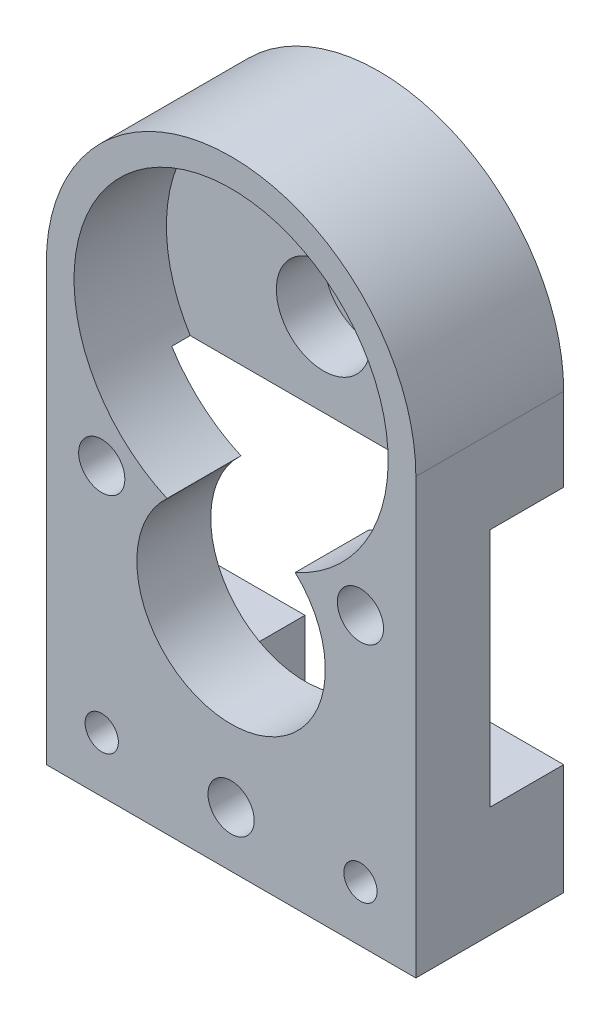
ISO-10303-21;
HEADER;
FILE_DESCRIPTION(('STEP AP214'),'2;1');
FILE_NAME('part.step','',(''),(''),'','','');
FILE_SCHEMA(('AUTOMOTIVE_DESIGN { 1 0 10303 214 1 1 1 1 }'));
ENDSEC;
DATA;
#1=APPLICATION_CONTEXT('core data for automotive mechanical design processes');
#2=APPLICATION_PROTOCOL_DEFINITION('international standard','automotive_design',2000,#1);
#3=PRODUCT_CONTEXT('',#1,'mechanical');
#4=PRODUCT('Part','Part','',(#3));
#5=PRODUCT_RELATED_PRODUCT_CATEGORY('part','',(#4));
#6=PRODUCT_DEFINITION_FORMATION('','',#4);
#7=PRODUCT_DEFINITION_CONTEXT('part definition',#1,'design');
#8=PRODUCT_DEFINITION('design','',#6,#7);
#9=PRODUCT_DEFINITION_SHAPE('','',#8);
#10=(LENGTH_UNIT() NAMED_UNIT(*) SI_UNIT(.MILLI.,.METRE.));
#11=(NAMED_UNIT(*) PLANE_ANGLE_UNIT() SI_UNIT($,.RADIAN.));
#12=(NAMED_UNIT(*) SI_UNIT($,.STERADIAN.) SOLID_ANGLE_UNIT());
#13=UNCERTAINTY_MEASURE_WITH_UNIT(LENGTH_MEASURE(1.E-05),#10,'distance_accuracy_value','');
#14=(GEOMETRIC_REPRESENTATION_CONTEXT(3) GLOBAL_UNCERTAINTY_ASSIGNED_CONTEXT((#13)) GLOBAL_UNIT_ASSIGNED_CONTEXT((#10,
#11,#12)) REPRESENTATION_CONTEXT('',''));
#15=CARTESIAN_POINT('',(0.,0.,0.));
#16=DIRECTION('',(0.,0.,1.));
#17=DIRECTION('',(1.,0.,0.));
#18=AXIS2_PLACEMENT_3D('',#15,#16,#17);
#19=CARTESIAN_POINT('',(0.,0.,0.));
#20=DIRECTION('',(0.,0.,1.));
#21=DIRECTION('',(1.,0.,0.));
#22=AXIS2_PLACEMENT_3D('',#19,#20,#21);
#23=PLANE('',#22);
#24=CARTESIAN_POINT('',(0.,-9.,0.));
#25=DIRECTION('',(0.,0.,1.));
#26=DIRECTION('',(1.,0.,0.));
#27=AXIS2_PLACEMENT_3D('',#24,#25,#26);
#28=CIRCLE('',#27,2.);
#29=CARTESIAN_POINT('',(2.,-9.,0.));
#30=VERTEX_POINT('',#29);
#31=EDGE_CURVE('E343',#30,#30,#28,.T.);
#32=ORIENTED_EDGE('',*,*,#31,.T.);
#33=EDGE_LOOP('',(#32));
#34=FACE_BOUND('',#33,.T.);
#35=CARTESIAN_POINT('',(7.,3.49999999999994,0.));
#36=DIRECTION('',(0.,0.,1.));
#37=DIRECTION('',(1.,0.,0.));
#38=AXIS2_PLACEMENT_3D('',#35,#36,#37);
#39=CIRCLE('',#38,2.);
#40=CARTESIAN_POINT('',(9.,3.49999999999994,0.));
#41=VERTEX_POINT('',#40);
#42=EDGE_CURVE('E340',#41,#41,#39,.T.);
#43=ORIENTED_EDGE('',*,*,#42,.T.);
#44=EDGE_LOOP('',(#43));
#45=FACE_BOUND('',#44,.T.);
#46=CARTESIAN_POINT('',(-7.,3.49999999999994,0.));
#47=DIRECTION('',(0.,0.,1.));
#48=DIRECTION('',(1.,0.,0.));
#49=AXIS2_PLACEMENT_3D('',#46,#47,#48);
#50=CIRCLE('',#49,2.);
#51=CARTESIAN_POINT('',(-5.,3.49999999999994,0.));
#52=VERTEX_POINT('',#51);
#53=EDGE_CURVE('E337',#52,#52,#50,.T.);
#54=ORIENTED_EDGE('',*,*,#53,.T.);
#55=EDGE_LOOP('',(#54));
#56=FACE_BOUND('',#55,.T.);
#57=DIRECTION('',(-1.,0.,0.));
#58=VECTOR('',#57,1.);
#59=CARTESIAN_POINT('',(-10.,6.99999999999994,0.));
#60=LINE('',#59,#58);
#61=CARTESIAN_POINT('',(10.,6.99999999999994,0.));
#62=VERTEX_POINT('',#61);
#63=CARTESIAN_POINT('',(7.21110255092378,6.99999999999994,0.));
#64=VERTEX_POINT('',#63);
#65=EDGE_CURVE('E181',#62,#64,#60,.T.);
#66=ORIENTED_EDGE('',*,*,#65,.F.);
#67=DIRECTION('',(0.,-1.,0.));
#68=VECTOR('',#67,1.);
#69=CARTESIAN_POINT('',(10.,11.4999999999999,0.));
#70=LINE('',#69,#68);
#71=CARTESIAN_POINT('',(10.,-6.,0.));
#72=VERTEX_POINT('',#71);
#73=EDGE_CURVE('E394',#62,#72,#70,.T.);
#74=ORIENTED_EDGE('',*,*,#73,.T.);
#75=DIRECTION('',(-1.,0.,0.));
#76=VECTOR('',#75,1.);
#77=CARTESIAN_POINT('',(-10.,-6.,0.));
#78=LINE('',#77,#76);
#79=CARTESIAN_POINT('',(4.,-6.,0.));
#80=VERTEX_POINT('',#79);
#81=EDGE_CURVE('E410',#72,#80,#78,.T.);
#82=ORIENTED_EDGE('',*,*,#81,.T.);
#83=DIRECTION('',(0.,-1.,0.));
#84=VECTOR('',#83,1.);
#85=CARTESIAN_POINT('',(4.,0.,0.));
#86=LINE('',#85,#84);
#87=CARTESIAN_POINT('',(4.,-12.,0.));
#88=VERTEX_POINT('',#87);
#89=EDGE_CURVE('E365',#80,#88,#86,.T.);
#90=ORIENTED_EDGE('',*,*,#89,.T.);
#91=DIRECTION('',(-1.,0.,0.));
#92=VECTOR('',#91,1.);
#93=CARTESIAN_POINT('',(0.,-12.,0.));
#94=LINE('',#93,#92);
#95=CARTESIAN_POINT('',(-4.,-12.,0.));
#96=VERTEX_POINT('',#95);
#97=EDGE_CURVE('E369',#88,#96,#94,.T.);
#98=ORIENTED_EDGE('',*,*,#97,.T.);
#99=DIRECTION('',(0.,-1.,0.));
#100=VECTOR('',#99,1.);
#101=CARTESIAN_POINT('',(-4.,0.,0.));
#102=LINE('',#101,#100);
#103=CARTESIAN_POINT('',(-4.,-6.00000000000001,0.));
#104=VERTEX_POINT('',#103);
#105=EDGE_CURVE('E350',#104,#96,#102,.T.);
#106=ORIENTED_EDGE('',*,*,#105,.F.);
#107=CARTESIAN_POINT('',(-10.,-6.,0.));
#108=VERTEX_POINT('',#107);
#109=EDGE_CURVE('E413',#104,#108,#78,.T.);
#110=ORIENTED_EDGE('',*,*,#109,.T.);
#111=DIRECTION('',(0.,1.,0.));
#112=VECTOR('',#111,1.);
#113=CARTESIAN_POINT('',(-10.,11.4999999999999,0.));
#114=LINE('',#113,#112);
#115=CARTESIAN_POINT('',(-10.,6.99999999999994,0.));
#116=VERTEX_POINT('',#115);
#117=EDGE_CURVE('E174',#108,#116,#114,.T.);
#118=ORIENTED_EDGE('',*,*,#117,.T.);
#119=CARTESIAN_POINT('',(-7.21110255092379,6.99999999999994,0.));
#120=VERTEX_POINT('',#119);
#121=EDGE_CURVE('E275',#120,#116,#60,.T.);
#122=ORIENTED_EDGE('',*,*,#121,.F.);
#123=CARTESIAN_POINT('',(0.,11.4999999999999,0.));
#124=DIRECTION('',(0.,0.,1.));
#125=DIRECTION('',(1.,0.,0.));
#126=AXIS2_PLACEMENT_3D('',#123,#124,#125);
#127=CIRCLE('',#126,8.49999999999644);
#128=CARTESIAN_POINT('',(-3.46780218363991,3.73956521739389,0.));
#129=VERTEX_POINT('',#128);
#130=EDGE_CURVE('E284',#120,#129,#127,.T.);
#131=ORIENTED_EDGE('',*,*,#130,.T.);
#132=CARTESIAN_POINT('',(0.,0.,0.));
#133=DIRECTION('',(0.,0.,1.));
#134=DIRECTION('',(1.,0.,0.));
#135=AXIS2_PLACEMENT_3D('',#132,#133,#134);
#136=CIRCLE('',#135,5.1);
#137=CARTESIAN_POINT('',(3.46780218363991,3.73956521739389,0.));
#138=VERTEX_POINT('',#137);
#139=EDGE_CURVE('E297',#129,#138,#136,.T.);
#140=ORIENTED_EDGE('',*,*,#139,.T.);
#141=EDGE_CURVE('E292',#138,#64,#127,.T.);
#142=ORIENTED_EDGE('',*,*,#141,.T.);
#143=EDGE_LOOP('',(#66,#74,#82,#90,#98,#106,#110,#118,#122,#131,#140,#142));
#144=FACE_BOUND('',#143,.T.);
#145=ADVANCED_FACE('F157',(#34,#45,#56,#144),#23,.F.);
#146=CARTESIAN_POINT('',(-10.,-6.,-24.8806130178211));
#147=DIRECTION('',(0.,-1.,0.));
#148=DIRECTION('',(1.,0.,0.));
#149=AXIS2_PLACEMENT_3D('',#146,#147,#148);
#150=PLANE('',#149);
#151=DIRECTION('',(0.,0.,-1.));
#152=VECTOR('',#151,1.);
#153=CARTESIAN_POINT('',(-4.,-6.00000000000001,10.));
#154=LINE('',#153,#152);
#155=CARTESIAN_POINT('',(-4.,-6.00000000000001,-4.));
#156=VERTEX_POINT('',#155);
#157=EDGE_CURVE('E363',#104,#156,#154,.T.);
#158=ORIENTED_EDGE('',*,*,#157,.T.);
#159=DIRECTION('',(-1.,0.,0.));
#160=VECTOR('',#159,1.);
#161=CARTESIAN_POINT('',(-10.,-6.,-4.));
#162=LINE('',#161,#160);
#163=CARTESIAN_POINT('',(-10.,-6.,-4.));
#164=VERTEX_POINT('',#163);
#165=EDGE_CURVE('E386',#156,#164,#162,.T.);
#166=ORIENTED_EDGE('',*,*,#165,.T.);
#167=DIRECTION('',(0.,0.,1.));
#168=VECTOR('',#167,1.);
#169=CARTESIAN_POINT('',(-10.,-6.,-24.8806130178211));
#170=LINE('',#169,#168);
#171=EDGE_CURVE('E403',#164,#108,#170,.T.);
#172=ORIENTED_EDGE('',*,*,#171,.T.);
#173=ORIENTED_EDGE('',*,*,#109,.F.);
#174=EDGE_LOOP('',(#158,#166,#172,#173));
#175=FACE_BOUND('',#174,.T.);
#176=ADVANCED_FACE('F454',(#175),#150,.F.);
#177=CARTESIAN_POINT('',(0.,0.,-4.));
#178=DIRECTION('',(0.,0.,1.));
#179=DIRECTION('',(1.,0.,0.));
#180=AXIS2_PLACEMENT_3D('',#177,#178,#179);
#181=PLANE('',#180);
#182=CARTESIAN_POINT('',(-7.,-9.,-4.));
#183=DIRECTION('',(0.,0.,-1.));
#184=DIRECTION('',(-1.,0.,0.));
#185=AXIS2_PLACEMENT_3D('',#182,#183,#184);
#186=CIRCLE('',#185,0.900000000000001);
#187=CARTESIAN_POINT('',(-7.9,-9.,-4.));
#188=VERTEX_POINT('',#187);
#189=EDGE_CURVE('E520',#188,#188,#186,.T.);
#190=ORIENTED_EDGE('',*,*,#189,.F.);
#191=EDGE_LOOP('',(#190));
#192=FACE_BOUND('',#191,.T.);
#193=DIRECTION('',(0.,-1.,0.));
#194=VECTOR('',#193,1.);
#195=CARTESIAN_POINT('',(-4.,0.,-4.));
#196=LINE('',#195,#194);
#197=CARTESIAN_POINT('',(-4.,-12.,-4.));
#198=VERTEX_POINT('',#197);
#199=EDGE_CURVE('E359',#156,#198,#196,.T.);
#200=ORIENTED_EDGE('',*,*,#199,.T.);
#201=DIRECTION('',(1.,0.,0.));
#202=VECTOR('',#201,1.);
#203=CARTESIAN_POINT('',(-10.,-12.,-4.));
#204=LINE('',#203,#202);
#205=CARTESIAN_POINT('',(-10.,-12.,-4.));
#206=VERTEX_POINT('',#205);
#207=EDGE_CURVE('E387',#206,#198,#204,.T.);
#208=ORIENTED_EDGE('',*,*,#207,.F.);
#209=DIRECTION('',(0.,-1.,0.));
#210=VECTOR('',#209,1.);
#211=CARTESIAN_POINT('',(-10.,-6.,-4.));
#212=LINE('',#211,#210);
#213=EDGE_CURVE('E391',#164,#206,#212,.T.);
#214=ORIENTED_EDGE('',*,*,#213,.F.);
#215=ORIENTED_EDGE('',*,*,#165,.F.);
#216=EDGE_LOOP('',(#200,#208,#214,#215));
#217=FACE_BOUND('',#216,.T.);
#218=ADVANCED_FACE('F427',(#192,#217),#181,.F.);
#219=CARTESIAN_POINT('',(0.,0.,4.));
#220=DIRECTION('',(0.,0.,1.));
#221=DIRECTION('',(1.,0.,0.));
#222=AXIS2_PLACEMENT_3D('',#219,#220,#221);
#223=PLANE('',#222);
#224=CARTESIAN_POINT('',(-7.,-9.,4.));
#225=DIRECTION('',(0.,0.,-1.));
#226=DIRECTION('',(-1.,0.,0.));
#227=AXIS2_PLACEMENT_3D('',#224,#225,#226);
#228=CIRCLE('',#227,0.900000000000001);
#229=CARTESIAN_POINT('',(-7.9,-9.,4.));
#230=VERTEX_POINT('',#229);
#231=EDGE_CURVE('E517',#230,#230,#228,.T.);
#232=ORIENTED_EDGE('',*,*,#231,.T.);
#233=EDGE_LOOP('',(#232));
#234=FACE_BOUND('',#233,.T.);
#235=CARTESIAN_POINT('',(7.,-9.,4.));
#236=DIRECTION('',(0.,0.,-1.));
#237=DIRECTION('',(-1.,0.,0.));
#238=AXIS2_PLACEMENT_3D('',#235,#236,#237);
#239=CIRCLE('',#238,0.899999999999999);
#240=CARTESIAN_POINT('',(6.1,-9.,4.));
#241=VERTEX_POINT('',#240);
#242=EDGE_CURVE('E526',#241,#241,#239,.T.);
#243=ORIENTED_EDGE('',*,*,#242,.T.);
#244=EDGE_LOOP('',(#243));
#245=FACE_BOUND('',#244,.T.);
#246=CARTESIAN_POINT('',(0.,-9.,4.));
#247=DIRECTION('',(0.,0.,-1.));
#248=DIRECTION('',(-1.,0.,0.));
#249=AXIS2_PLACEMENT_3D('',#246,#247,#248);
#250=CIRCLE('',#249,1.25);
#251=CARTESIAN_POINT('',(-1.25,-9.,4.));
#252=VERTEX_POINT('',#251);
#253=EDGE_CURVE('E346',#252,#252,#250,.T.);
#254=ORIENTED_EDGE('',*,*,#253,.T.);
#255=EDGE_LOOP('',(#254));
#256=FACE_BOUND('',#255,.T.);
#257=CARTESIAN_POINT('',(0.,11.4999999999999,4.));
#258=DIRECTION('',(0.,0.,1.));
#259=DIRECTION('',(1.,0.,0.));
#260=AXIS2_PLACEMENT_3D('',#257,#258,#259);
#261=CIRCLE('',#260,8.49999999999644);
#262=CARTESIAN_POINT('',(3.46780218363991,3.73956521739389,4.));
#263=VERTEX_POINT('',#262);
#264=CARTESIAN_POINT('',(-3.46780218363991,3.73956521739389,4.));
#265=VERTEX_POINT('',#264);
#266=EDGE_CURVE('E326',#263,#265,#261,.T.);
#267=ORIENTED_EDGE('',*,*,#266,.F.);
#268=CARTESIAN_POINT('',(0.,0.,4.));
#269=DIRECTION('',(0.,0.,1.));
#270=DIRECTION('',(1.,0.,0.));
#271=AXIS2_PLACEMENT_3D('',#268,#269,#270);
#272=CIRCLE('',#271,5.1);
#273=EDGE_CURVE('E323',#265,#263,#272,.T.);
#274=ORIENTED_EDGE('',*,*,#273,.F.);
#275=EDGE_LOOP('',(#267,#274));
#276=FACE_BOUND('',#275,.T.);
#277=CARTESIAN_POINT('',(-7.,3.49999999999994,4.));
#278=DIRECTION('',(0.,0.,1.));
#279=DIRECTION('',(1.,0.,0.));
#280=AXIS2_PLACEMENT_3D('',#277,#278,#279);
#281=CIRCLE('',#280,1.25);
#282=CARTESIAN_POINT('',(-5.75,3.49999999999994,4.));
#283=VERTEX_POINT('',#282);
#284=EDGE_CURVE('E320',#283,#283,#281,.T.);
#285=ORIENTED_EDGE('',*,*,#284,.F.);
#286=EDGE_LOOP('',(#285));
#287=FACE_BOUND('',#286,.T.);
#288=CARTESIAN_POINT('',(0.,11.4999999999999,4.));
#289=DIRECTION('',(0.,0.,1.));
#290=DIRECTION('',(1.,0.,0.));
#291=AXIS2_PLACEMENT_3D('',#288,#289,#290);
#292=CIRCLE('',#291,10.);
#293=CARTESIAN_POINT('',(-10.,11.4999999999999,4.));
#294=VERTEX_POINT('',#293);
#295=CARTESIAN_POINT('',(10.,11.4999999999999,4.));
#296=VERTEX_POINT('',#295);
#297=EDGE_CURVE('E306',#294,#296,#292,.F.);
#298=ORIENTED_EDGE('',*,*,#297,.F.);
#299=DIRECTION('',(0.,1.,0.));
#300=VECTOR('',#299,1.);
#301=CARTESIAN_POINT('',(-10.,-6.,4.));
#302=LINE('',#301,#300);
#303=CARTESIAN_POINT('',(-10.,-12.,4.));
#304=VERTEX_POINT('',#303);
#305=EDGE_CURVE('E14',#304,#294,#302,.T.);
#306=ORIENTED_EDGE('',*,*,#305,.F.);
#307=DIRECTION('',(-1.,0.,0.));
#308=VECTOR('',#307,1.);
#309=CARTESIAN_POINT('',(-10.,-12.,4.));
#310=LINE('',#309,#308);
#311=CARTESIAN_POINT('',(10.,-12.,4.));
#312=VERTEX_POINT('',#311);
#313=EDGE_CURVE('E379',#312,#304,#310,.T.);
#314=ORIENTED_EDGE('',*,*,#313,.F.);
#315=DIRECTION('',(0.,1.,0.));
#316=VECTOR('',#315,1.);
#317=CARTESIAN_POINT('',(10.,-6.,4.));
#318=LINE('',#317,#316);
#319=EDGE_CURVE('E166',#312,#296,#318,.T.);
#320=ORIENTED_EDGE('',*,*,#319,.T.);
#321=EDGE_LOOP('',(#298,#306,#314,#320));
#322=FACE_BOUND('',#321,.T.);
#323=CARTESIAN_POINT('',(7.,3.49999999999994,4.));
#324=DIRECTION('',(0.,0.,1.));
#325=DIRECTION('',(1.,0.,0.));
#326=AXIS2_PLACEMENT_3D('',#323,#324,#325);
#327=CIRCLE('',#326,1.25);
#328=CARTESIAN_POINT('',(8.25,3.49999999999994,4.));
#329=VERTEX_POINT('',#328);
#330=EDGE_CURVE('E311',#329,#329,#327,.T.);
#331=ORIENTED_EDGE('',*,*,#330,.F.);
#332=EDGE_LOOP('',(#331));
#333=FACE_BOUND('',#332,.T.);
#334=ADVANCED_FACE('F423',(#234,#245,#256,#276,#287,#322,#333),#223,.T.);
#335=CARTESIAN_POINT('',(0.,0.,-4.));
#336=DIRECTION('',(0.,0.,1.));
#337=DIRECTION('',(1.,0.,0.));
#338=AXIS2_PLACEMENT_3D('',#335,#336,#337);
#339=PLANE('',#338);
#340=CARTESIAN_POINT('',(0.,16.,-4.));
#341=DIRECTION('',(0.,0.,-1.));
#342=DIRECTION('',(-1.,0.,0.));
#343=AXIS2_PLACEMENT_3D('',#340,#341,#342);
#344=CIRCLE('',#343,0.900000000000001);
#345=CARTESIAN_POINT('',(-0.900000000000001,16.,-4.));
#346=VERTEX_POINT('',#345);
#347=EDGE_CURVE('E509',#346,#346,#344,.T.);
#348=ORIENTED_EDGE('',*,*,#347,.F.);
#349=EDGE_LOOP('',(#348));
#350=FACE_BOUND('',#349,.T.);
#351=CARTESIAN_POINT('',(0.,11.4999999999999,-4.));
#352=DIRECTION('',(0.,0.,-1.));
#353=DIRECTION('',(-1.,0.,0.));
#354=AXIS2_PLACEMENT_3D('',#351,#352,#353);
#355=CIRCLE('',#354,10.);
#356=CARTESIAN_POINT('',(-10.,11.4999999999999,-4.));
#357=VERTEX_POINT('',#356);
#358=CARTESIAN_POINT('',(10.,11.4999999999999,-4.));
#359=VERTEX_POINT('',#358);
#360=EDGE_CURVE('E308',#357,#359,#355,.T.);
#361=ORIENTED_EDGE('',*,*,#360,.T.);
#362=DIRECTION('',(0.,1.,0.));
#363=VECTOR('',#362,1.);
#364=CARTESIAN_POINT('',(10.,11.4999999999999,-4.));
#365=LINE('',#364,#363);
#366=CARTESIAN_POINT('',(10.,6.99999999999994,-4.));
#367=VERTEX_POINT('',#366);
#368=EDGE_CURVE('E503',#367,#359,#365,.T.);
#369=ORIENTED_EDGE('',*,*,#368,.F.);
#370=DIRECTION('',(1.,0.,0.));
#371=VECTOR('',#370,1.);
#372=CARTESIAN_POINT('',(-10.,6.99999999999994,-4.));
#373=LINE('',#372,#371);
#374=CARTESIAN_POINT('',(-10.,6.99999999999994,-4.));
#375=VERTEX_POINT('',#374);
#376=EDGE_CURVE('E507',#375,#367,#373,.T.);
#377=ORIENTED_EDGE('',*,*,#376,.F.);
#378=DIRECTION('',(0.,-1.,0.));
#379=VECTOR('',#378,1.);
#380=CARTESIAN_POINT('',(-10.,11.4999999999999,-4.));
#381=LINE('',#380,#379);
#382=EDGE_CURVE('E506',#357,#375,#381,.T.);
#383=ORIENTED_EDGE('',*,*,#382,.F.);
#384=EDGE_LOOP('',(#361,#369,#377,#383));
#385=FACE_BOUND('',#384,.T.);
#386=ADVANCED_FACE('F426',(#350,#385),#339,.F.);
#387=CARTESIAN_POINT('',(10.,-6.,4.));
#388=DIRECTION('',(-1.,0.,0.));
#389=DIRECTION('',(0.,0.,1.));
#390=AXIS2_PLACEMENT_3D('',#387,#388,#389);
#391=PLANE('',#390);
#392=ORIENTED_EDGE('',*,*,#319,.F.);
#393=DIRECTION('',(0.,0.,1.));
#394=VECTOR('',#393,1.);
#395=CARTESIAN_POINT('',(10.,-12.,-24.8806130178211));
#396=LINE('',#395,#394);
#397=CARTESIAN_POINT('',(10.,-12.,-4.));
#398=VERTEX_POINT('',#397);
#399=EDGE_CURVE('E397',#398,#312,#396,.T.);
#400=ORIENTED_EDGE('',*,*,#399,.F.);
#401=DIRECTION('',(0.,1.,0.));
#402=VECTOR('',#401,1.);
#403=CARTESIAN_POINT('',(10.,-6.,-4.));
#404=LINE('',#403,#402);
#405=CARTESIAN_POINT('',(10.,-6.,-4.));
#406=VERTEX_POINT('',#405);
#407=EDGE_CURVE('E383',#398,#406,#404,.T.);
#408=ORIENTED_EDGE('',*,*,#407,.T.);
#409=DIRECTION('',(0.,0.,1.));
#410=VECTOR('',#409,1.);
#411=CARTESIAN_POINT('',(10.,-6.,-24.8806130178211));
#412=LINE('',#411,#410);
#413=EDGE_CURVE('E400',#406,#72,#412,.T.);
#414=ORIENTED_EDGE('',*,*,#413,.T.);
#415=ORIENTED_EDGE('',*,*,#73,.F.);
#416=DIRECTION('',(0.,0.,1.));
#417=VECTOR('',#416,1.);
#418=CARTESIAN_POINT('',(10.,6.99999999999994,-24.5));
#419=LINE('',#418,#417);
#420=EDGE_CURVE('E513',#367,#62,#419,.T.);
#421=ORIENTED_EDGE('',*,*,#420,.F.);
#422=ORIENTED_EDGE('',*,*,#368,.T.);
#423=DIRECTION('',(0.,0.,-1.));
#424=VECTOR('',#423,1.);
#425=CARTESIAN_POINT('',(10.,11.4999999999999,29.30316185776));
#426=LINE('',#425,#424);
#427=EDGE_CURVE('E315',#296,#359,#426,.T.);
#428=ORIENTED_EDGE('',*,*,#427,.F.);
#429=EDGE_LOOP('',(#392,#400,#408,#414,#415,#421,#422,#428));
#430=FACE_BOUND('',#429,.T.);
#431=ADVANCED_FACE('F159',(#430),#391,.F.);
#432=CARTESIAN_POINT('',(-10.,-6.,4.));
#433=DIRECTION('',(-1.,0.,0.));
#434=DIRECTION('',(0.,0.,1.));
#435=AXIS2_PLACEMENT_3D('',#432,#433,#434);
#436=PLANE('',#435);
#437=ORIENTED_EDGE('',*,*,#117,.F.);
#438=ORIENTED_EDGE('',*,*,#171,.F.);
#439=ORIENTED_EDGE('',*,*,#213,.T.);
#440=DIRECTION('',(0.,0.,1.));
#441=VECTOR('',#440,1.);
#442=CARTESIAN_POINT('',(-10.,-12.,-24.8806130178211));
#443=LINE('',#442,#441);
#444=EDGE_CURVE('E382',#206,#304,#443,.T.);
#445=ORIENTED_EDGE('',*,*,#444,.T.);
#446=ORIENTED_EDGE('',*,*,#305,.T.);
#447=DIRECTION('',(0.,0.,-1.));
#448=VECTOR('',#447,1.);
#449=CARTESIAN_POINT('',(-10.,11.4999999999999,29.30316185776));
#450=LINE('',#449,#448);
#451=EDGE_CURVE('E312',#294,#357,#450,.T.);
#452=ORIENTED_EDGE('',*,*,#451,.T.);
#453=ORIENTED_EDGE('',*,*,#382,.T.);
#454=DIRECTION('',(0.,0.,1.));
#455=VECTOR('',#454,1.);
#456=CARTESIAN_POINT('',(-10.,6.99999999999994,-24.5));
#457=LINE('',#456,#455);
#458=EDGE_CURVE('E511',#375,#116,#457,.T.);
#459=ORIENTED_EDGE('',*,*,#458,.T.);
#460=EDGE_LOOP('',(#437,#438,#439,#445,#446,#452,#453,#459));
#461=FACE_BOUND('',#460,.T.);
#462=ADVANCED_FACE('F544',(#461),#436,.T.);
#463=CARTESIAN_POINT('',(0.,11.4999999999999,4.));
#464=DIRECTION('',(0.,0.,-1.));
#465=DIRECTION('',(-1.,0.,0.));
#466=AXIS2_PLACEMENT_3D('',#463,#464,#465);
#467=CYLINDRICAL_SURFACE('',#466,8.49999999999644);
#468=ORIENTED_EDGE('',*,*,#130,.F.);
#469=DIRECTION('',(0.,0.,1.));
#470=VECTOR('',#469,1.);
#471=CARTESIAN_POINT('',(-7.21110255092379,6.99999999999994,-25.0416305603326));
#472=LINE('',#471,#470);
#473=CARTESIAN_POINT('',(-7.21110255092379,6.99999999999994,-1.));
#474=VERTEX_POINT('',#473);
#475=EDGE_CURVE('E272',#474,#120,#472,.T.);
#476=ORIENTED_EDGE('',*,*,#475,.F.);
#477=CARTESIAN_POINT('',(0.,11.4999999999999,-1.));
#478=DIRECTION('',(0.,0.,-1.));
#479=DIRECTION('',(-1.,0.,0.));
#480=AXIS2_PLACEMENT_3D('',#477,#478,#479);
#481=CIRCLE('',#480,8.49999999999644);
#482=CARTESIAN_POINT('',(7.21110255092378,6.99999999999994,-1.));
#483=VERTEX_POINT('',#482);
#484=EDGE_CURVE('E304',#474,#483,#481,.T.);
#485=ORIENTED_EDGE('',*,*,#484,.T.);
#486=DIRECTION('',(0.,0.,1.));
#487=VECTOR('',#486,1.);
#488=CARTESIAN_POINT('',(7.21110255092378,6.99999999999994,-25.0416305603326));
#489=LINE('',#488,#487);
#490=EDGE_CURVE('E282',#64,#483,#489,.F.);
#491=ORIENTED_EDGE('',*,*,#490,.F.);
#492=ORIENTED_EDGE('',*,*,#141,.F.);
#493=DIRECTION('',(0.,0.,-1.));
#494=VECTOR('',#493,1.);
#495=CARTESIAN_POINT('',(3.46780218363991,3.73956521739389,4.));
#496=LINE('',#495,#494);
#497=EDGE_CURVE('E328',#263,#138,#496,.T.);
#498=ORIENTED_EDGE('',*,*,#497,.F.);
#499=ORIENTED_EDGE('',*,*,#266,.T.);
#500=DIRECTION('',(0.,0.,-1.));
#501=VECTOR('',#500,1.);
#502=CARTESIAN_POINT('',(-3.46780218363991,3.73956521739389,4.));
#503=LINE('',#502,#501);
#504=EDGE_CURVE('E290',#265,#129,#503,.T.);
#505=ORIENTED_EDGE('',*,*,#504,.T.);
#506=EDGE_LOOP('',(#468,#476,#485,#491,#492,#498,#499,#505));
#507=FACE_BOUND('',#506,.T.);
#508=ADVANCED_FACE('F288',(#507),#467,.F.);
#509=CARTESIAN_POINT('',(0.,0.,4.));
#510=DIRECTION('',(0.,0.,-1.));
#511=DIRECTION('',(-1.,0.,0.));
#512=AXIS2_PLACEMENT_3D('',#509,#510,#511);
#513=CYLINDRICAL_SURFACE('',#512,5.1);
#514=ORIENTED_EDGE('',*,*,#139,.F.);
#515=ORIENTED_EDGE('',*,*,#504,.F.);
#516=ORIENTED_EDGE('',*,*,#273,.T.);
#517=ORIENTED_EDGE('',*,*,#497,.T.);
#518=EDGE_LOOP('',(#514,#515,#516,#517));
#519=FACE_BOUND('',#518,.T.);
#520=ADVANCED_FACE('F420',(#519),#513,.F.);
#521=CARTESIAN_POINT('',(-7.,3.49999999999994,4.));
#522=DIRECTION('',(0.,0.,-1.));
#523=DIRECTION('',(-1.,0.,0.));
#524=AXIS2_PLACEMENT_3D('',#521,#522,#523);
#525=CYLINDRICAL_SURFACE('',#524,1.25);
#526=CARTESIAN_POINT('',(-7.,3.49999999999994,2.));
#527=DIRECTION('',(0.,0.,1.));
#528=DIRECTION('',(1.,0.,0.));
#529=AXIS2_PLACEMENT_3D('',#526,#527,#528);
#530=CIRCLE('',#529,1.25);
#531=CARTESIAN_POINT('',(-5.75,3.49999999999994,2.));
#532=VERTEX_POINT('',#531);
#533=EDGE_CURVE('E307',#532,#532,#530,.T.);
#534=ORIENTED_EDGE('',*,*,#533,.F.);
#535=EDGE_LOOP('',(#534));
#536=FACE_BOUND('',#535,.T.);
#537=ORIENTED_EDGE('',*,*,#284,.T.);
#538=EDGE_LOOP('',(#537));
#539=FACE_BOUND('',#538,.T.);
#540=ADVANCED_FACE('F439',(#536,#539),#525,.F.);
#541=CARTESIAN_POINT('',(7.,3.49999999999994,4.));
#542=DIRECTION('',(0.,0.,-1.));
#543=DIRECTION('',(-1.,0.,0.));
#544=AXIS2_PLACEMENT_3D('',#541,#542,#543);
#545=CYLINDRICAL_SURFACE('',#544,1.25);
#546=CARTESIAN_POINT('',(7.,3.49999999999994,2.));
#547=DIRECTION('',(0.,0.,1.));
#548=DIRECTION('',(1.,0.,0.));
#549=AXIS2_PLACEMENT_3D('',#546,#547,#548);
#550=CIRCLE('',#549,1.25);
#551=CARTESIAN_POINT('',(8.25,3.49999999999994,2.));
#552=VERTEX_POINT('',#551);
#553=EDGE_CURVE('E302',#552,#552,#550,.T.);
#554=ORIENTED_EDGE('',*,*,#553,.F.);
#555=EDGE_LOOP('',(#554));
#556=FACE_BOUND('',#555,.T.);
#557=ORIENTED_EDGE('',*,*,#330,.T.);
#558=EDGE_LOOP('',(#557));
#559=FACE_BOUND('',#558,.T.);
#560=ADVANCED_FACE('F436',(#556,#559),#545,.F.);
#561=CARTESIAN_POINT('',(0.,11.4999999999999,29.30316185776));
#562=DIRECTION('',(0.,0.,-1.));
#563=DIRECTION('',(-1.,0.,0.));
#564=AXIS2_PLACEMENT_3D('',#561,#562,#563);
#565=CYLINDRICAL_SURFACE('',#564,10.);
#566=ORIENTED_EDGE('',*,*,#451,.F.);
#567=ORIENTED_EDGE('',*,*,#297,.T.);
#568=ORIENTED_EDGE('',*,*,#427,.T.);
#569=ORIENTED_EDGE('',*,*,#360,.F.);
#570=EDGE_LOOP('',(#566,#567,#568,#569));
#571=FACE_BOUND('',#570,.T.);
#572=ADVANCED_FACE('F438',(#571),#565,.T.);
#573=CARTESIAN_POINT('',(0.,0.,-1.));
#574=DIRECTION('',(0.,0.,-1.));
#575=DIRECTION('',(-1.,0.,0.));
#576=AXIS2_PLACEMENT_3D('',#573,#574,#575);
#577=PLANE('',#576);
#578=CARTESIAN_POINT('',(0.,11.4999999999999,-1.));
#579=DIRECTION('',(0.,0.,1.));
#580=DIRECTION('',(1.,0.,0.));
#581=AXIS2_PLACEMENT_3D('',#578,#579,#580);
#582=CIRCLE('',#581,2.55);
#583=CARTESIAN_POINT('',(2.55000000000001,11.4999999999999,-1.));
#584=VERTEX_POINT('',#583);
#585=EDGE_CURVE('E491',#584,#584,#582,.T.);
#586=ORIENTED_EDGE('',*,*,#585,.F.);
#587=EDGE_LOOP('',(#586));
#588=FACE_BOUND('',#587,.T.);
#589=CARTESIAN_POINT('',(0.,16.,-1.));
#590=DIRECTION('',(0.,0.,-1.));
#591=DIRECTION('',(-1.,0.,0.));
#592=AXIS2_PLACEMENT_3D('',#589,#590,#591);
#593=CIRCLE('',#592,0.900000000000001);
#594=CARTESIAN_POINT('',(-0.900000000000001,16.,-1.));
#595=VERTEX_POINT('',#594);
#596=EDGE_CURVE('E161',#595,#595,#593,.T.);
#597=ORIENTED_EDGE('',*,*,#596,.T.);
#598=EDGE_LOOP('',(#597));
#599=FACE_BOUND('',#598,.T.);
#600=ORIENTED_EDGE('',*,*,#484,.F.);
#601=DIRECTION('',(-1.,0.,0.));
#602=VECTOR('',#601,1.);
#603=CARTESIAN_POINT('',(-10.,6.99999999999994,-1.));
#604=LINE('',#603,#602);
#605=EDGE_CURVE('E279',#483,#474,#604,.T.);
#606=ORIENTED_EDGE('',*,*,#605,.F.);
#607=EDGE_LOOP('',(#600,#606));
#608=FACE_BOUND('',#607,.T.);
#609=ADVANCED_FACE('F447',(#588,#599,#608),#577,.F.);
#610=CARTESIAN_POINT('',(7.,3.49999999999994,9.65685424949238));
#611=DIRECTION('',(0.,0.,-1.));
#612=DIRECTION('',(-1.,0.,0.));
#613=AXIS2_PLACEMENT_3D('',#610,#611,#612);
#614=CYLINDRICAL_SURFACE('',#613,2.);
#615=ORIENTED_EDGE('',*,*,#42,.F.);
#616=EDGE_LOOP('',(#615));
#617=FACE_BOUND('',#616,.T.);
#618=CARTESIAN_POINT('',(7.,3.49999999999994,2.));
#619=DIRECTION('',(0.,0.,1.));
#620=DIRECTION('',(1.,0.,0.));
#621=AXIS2_PLACEMENT_3D('',#618,#619,#620);
#622=CIRCLE('',#621,2.);
#623=CARTESIAN_POINT('',(9.,3.49999999999994,2.));
#624=VERTEX_POINT('',#623);
#625=EDGE_CURVE('E291',#624,#624,#622,.T.);
#626=ORIENTED_EDGE('',*,*,#625,.T.);
#627=EDGE_LOOP('',(#626));
#628=FACE_BOUND('',#627,.T.);
#629=ADVANCED_FACE('F477',(#617,#628),#614,.F.);
#630=CARTESIAN_POINT('',(0.,0.,2.));
#631=DIRECTION('',(0.,0.,1.));
#632=DIRECTION('',(1.,0.,0.));
#633=AXIS2_PLACEMENT_3D('',#630,#631,#632);
#634=PLANE('',#633);
#635=ORIENTED_EDGE('',*,*,#553,.T.);
#636=EDGE_LOOP('',(#635));
#637=FACE_BOUND('',#636,.T.);
#638=ORIENTED_EDGE('',*,*,#625,.F.);
#639=EDGE_LOOP('',(#638));
#640=FACE_BOUND('',#639,.T.);
#641=ADVANCED_FACE('F469',(#637,#640),#634,.F.);
#642=CARTESIAN_POINT('',(-7.,3.49999999999994,9.65685424949238));
#643=DIRECTION('',(0.,0.,-1.));
#644=DIRECTION('',(-1.,0.,0.));
#645=AXIS2_PLACEMENT_3D('',#642,#643,#644);
#646=CYLINDRICAL_SURFACE('',#645,2.);
#647=ORIENTED_EDGE('',*,*,#53,.F.);
#648=EDGE_LOOP('',(#647));
#649=FACE_BOUND('',#648,.T.);
#650=CARTESIAN_POINT('',(-7.,3.49999999999994,2.));
#651=DIRECTION('',(0.,0.,1.));
#652=DIRECTION('',(1.,0.,0.));
#653=AXIS2_PLACEMENT_3D('',#650,#651,#652);
#654=CIRCLE('',#653,2.);
#655=CARTESIAN_POINT('',(-5.,3.49999999999994,2.));
#656=VERTEX_POINT('',#655);
#657=EDGE_CURVE('E295',#656,#656,#654,.T.);
#658=ORIENTED_EDGE('',*,*,#657,.T.);
#659=EDGE_LOOP('',(#658));
#660=FACE_BOUND('',#659,.T.);
#661=ADVANCED_FACE('F465',(#649,#660),#646,.F.);
#662=CARTESIAN_POINT('',(0.,0.,2.));
#663=DIRECTION('',(0.,0.,1.));
#664=DIRECTION('',(1.,0.,0.));
#665=AXIS2_PLACEMENT_3D('',#662,#663,#664);
#666=PLANE('',#665);
#667=ORIENTED_EDGE('',*,*,#533,.T.);
#668=EDGE_LOOP('',(#667));
#669=FACE_BOUND('',#668,.T.);
#670=ORIENTED_EDGE('',*,*,#657,.F.);
#671=EDGE_LOOP('',(#670));
#672=FACE_BOUND('',#671,.T.);
#673=ADVANCED_FACE('F468',(#669,#672),#666,.F.);
#674=CARTESIAN_POINT('',(-10.,-12.,-24.8806130178211));
#675=DIRECTION('',(0.,1.,0.));
#676=DIRECTION('',(-1.,0.,0.));
#677=AXIS2_PLACEMENT_3D('',#674,#675,#676);
#678=PLANE('',#677);
#679=ORIENTED_EDGE('',*,*,#97,.F.);
#680=DIRECTION('',(0.,0.,-1.));
#681=VECTOR('',#680,1.);
#682=CARTESIAN_POINT('',(4.,-12.,10.));
#683=LINE('',#682,#681);
#684=CARTESIAN_POINT('',(4.,-12.,-4.));
#685=VERTEX_POINT('',#684);
#686=EDGE_CURVE('E367',#88,#685,#683,.T.);
#687=ORIENTED_EDGE('',*,*,#686,.T.);
#688=EDGE_CURVE('E406',#685,#398,#204,.T.);
#689=ORIENTED_EDGE('',*,*,#688,.T.);
#690=ORIENTED_EDGE('',*,*,#399,.T.);
#691=ORIENTED_EDGE('',*,*,#313,.T.);
#692=ORIENTED_EDGE('',*,*,#444,.F.);
#693=ORIENTED_EDGE('',*,*,#207,.T.);
#694=DIRECTION('',(0.,0.,-1.));
#695=VECTOR('',#694,1.);
#696=CARTESIAN_POINT('',(-4.,-12.,10.));
#697=LINE('',#696,#695);
#698=EDGE_CURVE('E372',#96,#198,#697,.T.);
#699=ORIENTED_EDGE('',*,*,#698,.F.);
#700=EDGE_LOOP('',(#679,#687,#689,#690,#691,#692,#693,#699));
#701=FACE_BOUND('',#700,.T.);
#702=ADVANCED_FACE('F473',(#701),#678,.F.);
#703=CARTESIAN_POINT('',(4.,-6.,-4.));
#704=VERTEX_POINT('',#703);
#705=EDGE_CURVE('E388',#406,#704,#162,.T.);
#706=ORIENTED_EDGE('',*,*,#705,.T.);
#707=DIRECTION('',(0.,0.,-1.));
#708=VECTOR('',#707,1.);
#709=CARTESIAN_POINT('',(4.,-6.,10.));
#710=LINE('',#709,#708);
#711=EDGE_CURVE('E362',#80,#704,#710,.T.);
#712=ORIENTED_EDGE('',*,*,#711,.F.);
#713=ORIENTED_EDGE('',*,*,#81,.F.);
#714=ORIENTED_EDGE('',*,*,#413,.F.);
#715=EDGE_LOOP('',(#706,#712,#713,#714));
#716=FACE_BOUND('',#715,.T.);
#717=ADVANCED_FACE('F462',(#716),#150,.F.);
#718=CARTESIAN_POINT('',(7.,-9.,-4.));
#719=DIRECTION('',(0.,0.,-1.));
#720=DIRECTION('',(-1.,0.,0.));
#721=AXIS2_PLACEMENT_3D('',#718,#719,#720);
#722=CIRCLE('',#721,0.899999999999999);
#723=CARTESIAN_POINT('',(6.1,-9.,-4.));
#724=VERTEX_POINT('',#723);
#725=EDGE_CURVE('E523',#724,#724,#722,.T.);
#726=ORIENTED_EDGE('',*,*,#725,.F.);
#727=EDGE_LOOP('',(#726));
#728=FACE_BOUND('',#727,.T.);
#729=ORIENTED_EDGE('',*,*,#688,.F.);
#730=DIRECTION('',(0.,-1.,0.));
#731=VECTOR('',#730,1.);
#732=CARTESIAN_POINT('',(4.,0.,-4.));
#733=LINE('',#732,#731);
#734=EDGE_CURVE('E354',#704,#685,#733,.T.);
#735=ORIENTED_EDGE('',*,*,#734,.F.);
#736=ORIENTED_EDGE('',*,*,#705,.F.);
#737=ORIENTED_EDGE('',*,*,#407,.F.);
#738=EDGE_LOOP('',(#729,#735,#736,#737));
#739=FACE_BOUND('',#738,.T.);
#740=ADVANCED_FACE('F554',(#728,#739),#181,.F.);
#741=CARTESIAN_POINT('',(4.,0.,10.));
#742=DIRECTION('',(1.,0.,0.));
#743=DIRECTION('',(0.,1.,0.));
#744=AXIS2_PLACEMENT_3D('',#741,#742,#743);
#745=PLANE('',#744);
#746=ORIENTED_EDGE('',*,*,#711,.T.);
#747=ORIENTED_EDGE('',*,*,#734,.T.);
#748=ORIENTED_EDGE('',*,*,#686,.F.);
#749=ORIENTED_EDGE('',*,*,#89,.F.);
#750=EDGE_LOOP('',(#746,#747,#748,#749));
#751=FACE_BOUND('',#750,.T.);
#752=ADVANCED_FACE('F578',(#751),#745,.F.);
#753=CARTESIAN_POINT('',(-4.,0.,10.));
#754=DIRECTION('',(1.,0.,0.));
#755=DIRECTION('',(0.,1.,0.));
#756=AXIS2_PLACEMENT_3D('',#753,#754,#755);
#757=PLANE('',#756);
#758=ORIENTED_EDGE('',*,*,#105,.T.);
#759=ORIENTED_EDGE('',*,*,#698,.T.);
#760=ORIENTED_EDGE('',*,*,#199,.F.);
#761=ORIENTED_EDGE('',*,*,#157,.F.);
#762=EDGE_LOOP('',(#758,#759,#760,#761));
#763=FACE_BOUND('',#762,.T.);
#764=ADVANCED_FACE('F563',(#763),#757,.T.);
#765=CARTESIAN_POINT('',(0.,-9.,4.));
#766=DIRECTION('',(0.,0.,-1.));
#767=DIRECTION('',(-1.,0.,0.));
#768=AXIS2_PLACEMENT_3D('',#765,#766,#767);
#769=CYLINDRICAL_SURFACE('',#768,1.25);
#770=CARTESIAN_POINT('',(0.,-9.,2.));
#771=DIRECTION('',(0.,0.,1.));
#772=DIRECTION('',(1.,0.,0.));
#773=AXIS2_PLACEMENT_3D('',#770,#771,#772);
#774=CIRCLE('',#773,1.25);
#775=CARTESIAN_POINT('',(1.25,-9.,2.));
#776=VERTEX_POINT('',#775);
#777=EDGE_CURVE('E341',#776,#776,#774,.F.);
#778=ORIENTED_EDGE('',*,*,#777,.T.);
#779=EDGE_LOOP('',(#778));
#780=FACE_BOUND('',#779,.T.);
#781=ORIENTED_EDGE('',*,*,#253,.F.);
#782=EDGE_LOOP('',(#781));
#783=FACE_BOUND('',#782,.T.);
#784=ADVANCED_FACE('F605',(#780,#783),#769,.F.);
#785=CARTESIAN_POINT('',(0.,-9.,7.65685424949238));
#786=DIRECTION('',(0.,0.,-1.));
#787=DIRECTION('',(-1.,0.,0.));
#788=AXIS2_PLACEMENT_3D('',#785,#786,#787);
#789=CYLINDRICAL_SURFACE('',#788,2.);
#790=CARTESIAN_POINT('',(0.,-9.,2.));
#791=DIRECTION('',(0.,0.,1.));
#792=DIRECTION('',(1.,0.,0.));
#793=AXIS2_PLACEMENT_3D('',#790,#791,#792);
#794=CIRCLE('',#793,2.);
#795=CARTESIAN_POINT('',(2.,-9.,2.));
#796=VERTEX_POINT('',#795);
#797=EDGE_CURVE('E344',#796,#796,#794,.F.);
#798=ORIENTED_EDGE('',*,*,#797,.F.);
#799=EDGE_LOOP('',(#798));
#800=FACE_BOUND('',#799,.T.);
#801=ORIENTED_EDGE('',*,*,#31,.F.);
#802=EDGE_LOOP('',(#801));
#803=FACE_BOUND('',#802,.T.);
#804=ADVANCED_FACE('F597',(#800,#803),#789,.F.);
#805=CARTESIAN_POINT('',(0.,0.,2.));
#806=DIRECTION('',(0.,0.,1.));
#807=DIRECTION('',(1.,0.,0.));
#808=AXIS2_PLACEMENT_3D('',#805,#806,#807);
#809=PLANE('',#808);
#810=ORIENTED_EDGE('',*,*,#797,.T.);
#811=EDGE_LOOP('',(#810));
#812=FACE_BOUND('',#811,.T.);
#813=ORIENTED_EDGE('',*,*,#777,.F.);
#814=EDGE_LOOP('',(#813));
#815=FACE_BOUND('',#814,.T.);
#816=ADVANCED_FACE('F589',(#812,#815),#809,.F.);
#817=CARTESIAN_POINT('',(7.,-9.,4.));
#818=DIRECTION('',(0.,0.,-1.));
#819=DIRECTION('',(-1.,0.,0.));
#820=AXIS2_PLACEMENT_3D('',#817,#818,#819);
#821=CYLINDRICAL_SURFACE('',#820,0.899999999999999);
#822=ORIENTED_EDGE('',*,*,#242,.F.);
#823=EDGE_LOOP('',(#822));
#824=FACE_BOUND('',#823,.T.);
#825=ORIENTED_EDGE('',*,*,#725,.T.);
#826=EDGE_LOOP('',(#825));
#827=FACE_BOUND('',#826,.T.);
#828=ADVANCED_FACE('F587',(#824,#827),#821,.F.);
#829=CARTESIAN_POINT('',(0.,16.,4.));
#830=DIRECTION('',(0.,0.,-1.));
#831=DIRECTION('',(-1.,0.,0.));
#832=AXIS2_PLACEMENT_3D('',#829,#830,#831);
#833=CYLINDRICAL_SURFACE('',#832,0.900000000000001);
#834=ORIENTED_EDGE('',*,*,#347,.T.);
#835=EDGE_LOOP('',(#834));
#836=FACE_BOUND('',#835,.T.);
#837=ORIENTED_EDGE('',*,*,#596,.F.);
#838=EDGE_LOOP('',(#837));
#839=FACE_BOUND('',#838,.T.);
#840=ADVANCED_FACE('F531',(#836,#839),#833,.F.);
#841=CARTESIAN_POINT('',(-7.,-9.,4.));
#842=DIRECTION('',(0.,0.,-1.));
#843=DIRECTION('',(-1.,0.,0.));
#844=AXIS2_PLACEMENT_3D('',#841,#842,#843);
#845=CYLINDRICAL_SURFACE('',#844,0.900000000000001);
#846=ORIENTED_EDGE('',*,*,#231,.F.);
#847=EDGE_LOOP('',(#846));
#848=FACE_BOUND('',#847,.T.);
#849=ORIENTED_EDGE('',*,*,#189,.T.);
#850=EDGE_LOOP('',(#849));
#851=FACE_BOUND('',#850,.T.);
#852=ADVANCED_FACE('F595',(#848,#851),#845,.F.);
#853=CARTESIAN_POINT('',(-10.,6.99999999999994,-24.5));
#854=DIRECTION('',(0.,1.,0.));
#855=DIRECTION('',(-1.,0.,0.));
#856=AXIS2_PLACEMENT_3D('',#853,#854,#855);
#857=PLANE('',#856);
#858=ORIENTED_EDGE('',*,*,#605,.T.);
#859=ORIENTED_EDGE('',*,*,#475,.T.);
#860=ORIENTED_EDGE('',*,*,#121,.T.);
#861=ORIENTED_EDGE('',*,*,#458,.F.);
#862=ORIENTED_EDGE('',*,*,#376,.T.);
#863=ORIENTED_EDGE('',*,*,#420,.T.);
#864=ORIENTED_EDGE('',*,*,#65,.T.);
#865=ORIENTED_EDGE('',*,*,#490,.T.);
#866=EDGE_LOOP('',(#858,#859,#860,#861,#862,#863,#864,#865));
#867=FACE_BOUND('',#866,.T.);
#868=ADVANCED_FACE('F273',(#867),#857,.F.);
#869=CARTESIAN_POINT('',(0.,11.4999999999999,-3.6));
#870=DIRECTION('',(0.,0.,1.));
#871=DIRECTION('',(1.,0.,0.));
#872=AXIS2_PLACEMENT_3D('',#869,#870,#871);
#873=CYLINDRICAL_SURFACE('',#872,2.55);
#874=CARTESIAN_POINT('',(0.,11.4999999999999,-3.6));
#875=DIRECTION('',(0.,0.,1.));
#876=DIRECTION('',(1.,0.,0.));
#877=AXIS2_PLACEMENT_3D('',#874,#875,#876);
#878=CIRCLE('',#877,2.55);
#879=CARTESIAN_POINT('',(2.55000000000001,11.4999999999999,-3.6));
#880=VERTEX_POINT('',#879);
#881=EDGE_CURVE('E497',#880,#880,#878,.T.);
#882=ORIENTED_EDGE('',*,*,#881,.F.);
#883=EDGE_LOOP('',(#882));
#884=FACE_BOUND('',#883,.T.);
#885=ORIENTED_EDGE('',*,*,#585,.T.);
#886=EDGE_LOOP('',(#885));
#887=FACE_BOUND('',#886,.T.);
#888=ADVANCED_FACE('F706',(#884,#887),#873,.F.);
#889=CARTESIAN_POINT('',(0.,11.4999999999999,-3.6));
#890=DIRECTION('',(0.,0.,1.));
#891=DIRECTION('',(1.,0.,0.));
#892=AXIS2_PLACEMENT_3D('',#889,#890,#891);
#893=PLANE('',#892);
#894=ORIENTED_EDGE('',*,*,#881,.T.);
#895=EDGE_LOOP('',(#894));
#896=FACE_BOUND('',#895,.T.);
#897=ADVANCED_FACE('F732',(#896),#893,.T.);
#898=CLOSED_SHELL('',(#145,#176,#218,#334,#386,#431,#462,#508,#520,#540,#560,#572,#609,#629,
#641,#661,#673,#702,#717,#740,#752,#764,#784,#804,#816,#828,#840,#852,#868,#888,#897));
#899=MANIFOLD_SOLID_BREP('B2',#898);
#900=ADVANCED_BREP_SHAPE_REPRESENTATION('',(#18,#899),#14);
#901=SHAPE_DEFINITION_REPRESENTATION(#9,#900);
ENDSEC;
END-ISO-10303-21;
